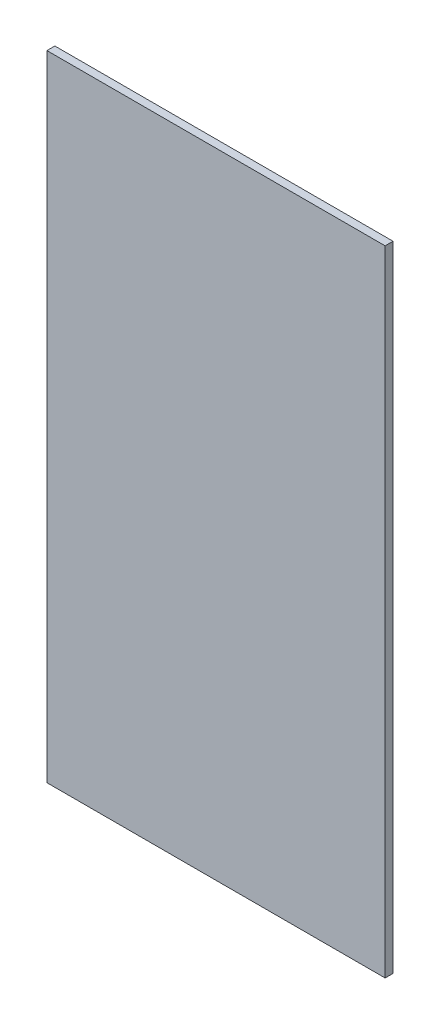
ISO-10303-21;
HEADER;
FILE_DESCRIPTION(('STEP AP214'),'2;1');
FILE_NAME('part.step','',(''),(''),'','','');
FILE_SCHEMA(('AUTOMOTIVE_DESIGN { 1 0 10303 214 1 1 1 1 }'));
ENDSEC;
DATA;
#1=APPLICATION_CONTEXT('core data for automotive mechanical design processes');
#2=APPLICATION_PROTOCOL_DEFINITION('international standard','automotive_design',2000,#1);
#3=PRODUCT_CONTEXT('',#1,'mechanical');
#4=PRODUCT('Part','Part','',(#3));
#5=PRODUCT_RELATED_PRODUCT_CATEGORY('part','',(#4));
#6=PRODUCT_DEFINITION_FORMATION('','',#4);
#7=PRODUCT_DEFINITION_CONTEXT('part definition',#1,'design');
#8=PRODUCT_DEFINITION('design','',#6,#7);
#9=PRODUCT_DEFINITION_SHAPE('','',#8);
#10=(LENGTH_UNIT() NAMED_UNIT(*) SI_UNIT(.MILLI.,.METRE.));
#11=(NAMED_UNIT(*) PLANE_ANGLE_UNIT() SI_UNIT($,.RADIAN.));
#12=(NAMED_UNIT(*) SI_UNIT($,.STERADIAN.) SOLID_ANGLE_UNIT());
#13=UNCERTAINTY_MEASURE_WITH_UNIT(LENGTH_MEASURE(1.E-05),#10,'distance_accuracy_value','');
#14=(GEOMETRIC_REPRESENTATION_CONTEXT(3) GLOBAL_UNCERTAINTY_ASSIGNED_CONTEXT((#13)) GLOBAL_UNIT_ASSIGNED_CONTEXT((#10,
#11,#12)) REPRESENTATION_CONTEXT('',''));
#15=CARTESIAN_POINT('',(0.,0.,0.));
#16=DIRECTION('',(0.,0.,1.));
#17=DIRECTION('',(1.,0.,0.));
#18=AXIS2_PLACEMENT_3D('',#15,#16,#17);
#19=CARTESIAN_POINT('',(1980.23201573366,1942.94051302504,19.05));
#20=DIRECTION('',(1.,0.,0.));
#21=DIRECTION('',(0.,0.,-1.));
#22=AXIS2_PLACEMENT_3D('',#19,#20,#21);
#23=PLANE('',#22);
#24=DIRECTION('',(0.,-1.,0.));
#25=VECTOR('',#24,1.);
#26=CARTESIAN_POINT('',(1980.23201573366,1942.94051302504,0.));
#27=LINE('',#26,#25);
#28=CARTESIAN_POINT('',(1980.23201573366,1942.94051302504,0.));
#29=VERTEX_POINT('',#28);
#30=CARTESIAN_POINT('',(1980.23201573366,418.94051302504,0.));
#31=VERTEX_POINT('',#30);
#32=EDGE_CURVE('E96',#29,#31,#27,.T.);
#33=ORIENTED_EDGE('',*,*,#32,.T.);
#34=DIRECTION('',(0.,0.,-1.));
#35=VECTOR('',#34,1.);
#36=CARTESIAN_POINT('',(1980.23201573366,418.94051302504,19.05));
#37=LINE('',#36,#35);
#38=CARTESIAN_POINT('',(1980.23201573366,418.94051302504,19.05));
#39=VERTEX_POINT('',#38);
#40=EDGE_CURVE('E11',#39,#31,#37,.T.);
#41=ORIENTED_EDGE('',*,*,#40,.F.);
#42=DIRECTION('',(0.,-1.,0.));
#43=VECTOR('',#42,1.);
#44=CARTESIAN_POINT('',(1980.23201573366,1942.94051302504,19.05));
#45=LINE('',#44,#43);
#46=CARTESIAN_POINT('',(1980.23201573366,1942.94051302504,19.05));
#47=VERTEX_POINT('',#46);
#48=EDGE_CURVE('E84',#47,#39,#45,.T.);
#49=ORIENTED_EDGE('',*,*,#48,.F.);
#50=DIRECTION('',(0.,0.,-1.));
#51=VECTOR('',#50,1.);
#52=CARTESIAN_POINT('',(1980.23201573366,1942.94051302504,19.05));
#53=LINE('',#52,#51);
#54=EDGE_CURVE('E92',#47,#29,#53,.T.);
#55=ORIENTED_EDGE('',*,*,#54,.T.);
#56=EDGE_LOOP('',(#33,#41,#49,#55));
#57=FACE_BOUND('',#56,.T.);
#58=ADVANCED_FACE('F33',(#57),#23,.F.);
#59=CARTESIAN_POINT('',(1980.23201573366,418.94051302504,19.05));
#60=DIRECTION('',(0.,1.,0.));
#61=DIRECTION('',(0.,0.,1.));
#62=AXIS2_PLACEMENT_3D('',#59,#60,#61);
#63=PLANE('',#62);
#64=DIRECTION('',(1.,0.,0.));
#65=VECTOR('',#64,1.);
#66=CARTESIAN_POINT('',(1980.23201573366,418.94051302504,0.));
#67=LINE('',#66,#65);
#68=CARTESIAN_POINT('',(2793.03201573366,418.94051302504,0.));
#69=VERTEX_POINT('',#68);
#70=EDGE_CURVE('E88',#31,#69,#67,.T.);
#71=ORIENTED_EDGE('',*,*,#70,.T.);
#72=DIRECTION('',(0.,0.,-1.));
#73=VECTOR('',#72,1.);
#74=CARTESIAN_POINT('',(2793.03201573366,418.94051302504,19.05));
#75=LINE('',#74,#73);
#76=CARTESIAN_POINT('',(2793.03201573366,418.94051302504,19.05));
#77=VERTEX_POINT('',#76);
#78=EDGE_CURVE('E41',#77,#69,#75,.T.);
#79=ORIENTED_EDGE('',*,*,#78,.F.);
#80=DIRECTION('',(1.,0.,0.));
#81=VECTOR('',#80,1.);
#82=CARTESIAN_POINT('',(1980.23201573366,418.94051302504,19.05));
#83=LINE('',#82,#81);
#84=EDGE_CURVE('E79',#39,#77,#83,.T.);
#85=ORIENTED_EDGE('',*,*,#84,.F.);
#86=ORIENTED_EDGE('',*,*,#40,.T.);
#87=EDGE_LOOP('',(#71,#79,#85,#86));
#88=FACE_BOUND('',#87,.T.);
#89=ADVANCED_FACE('F87',(#88),#63,.F.);
#90=CARTESIAN_POINT('',(2793.03201573366,418.94051302504,19.05));
#91=DIRECTION('',(-1.,0.,0.));
#92=DIRECTION('',(0.,0.,1.));
#93=AXIS2_PLACEMENT_3D('',#90,#91,#92);
#94=PLANE('',#93);
#95=DIRECTION('',(0.,1.,0.));
#96=VECTOR('',#95,1.);
#97=CARTESIAN_POINT('',(2793.03201573366,418.94051302504,0.));
#98=LINE('',#97,#96);
#99=CARTESIAN_POINT('',(2793.03201573366,1942.94051302504,0.));
#100=VERTEX_POINT('',#99);
#101=EDGE_CURVE('E66',#69,#100,#98,.T.);
#102=ORIENTED_EDGE('',*,*,#101,.T.);
#103=DIRECTION('',(0.,0.,-1.));
#104=VECTOR('',#103,1.);
#105=CARTESIAN_POINT('',(2793.03201573366,1942.94051302504,19.05));
#106=LINE('',#105,#104);
#107=CARTESIAN_POINT('',(2793.03201573366,1942.94051302504,19.05));
#108=VERTEX_POINT('',#107);
#109=EDGE_CURVE('E89',#108,#100,#106,.T.);
#110=ORIENTED_EDGE('',*,*,#109,.F.);
#111=DIRECTION('',(0.,1.,0.));
#112=VECTOR('',#111,1.);
#113=CARTESIAN_POINT('',(2793.03201573366,418.94051302504,19.05));
#114=LINE('',#113,#112);
#115=EDGE_CURVE('E82',#77,#108,#114,.T.);
#116=ORIENTED_EDGE('',*,*,#115,.F.);
#117=ORIENTED_EDGE('',*,*,#78,.T.);
#118=EDGE_LOOP('',(#102,#110,#116,#117));
#119=FACE_BOUND('',#118,.T.);
#120=ADVANCED_FACE('F90',(#119),#94,.F.);
#121=CARTESIAN_POINT('',(2793.03201573366,1942.94051302504,19.05));
#122=DIRECTION('',(0.,-1.,0.));
#123=DIRECTION('',(0.,0.,-1.));
#124=AXIS2_PLACEMENT_3D('',#121,#122,#123);
#125=PLANE('',#124);
#126=DIRECTION('',(-1.,0.,0.));
#127=VECTOR('',#126,1.);
#128=CARTESIAN_POINT('',(2793.03201573366,1942.94051302504,0.));
#129=LINE('',#128,#127);
#130=EDGE_CURVE('E72',#100,#29,#129,.T.);
#131=ORIENTED_EDGE('',*,*,#130,.T.);
#132=ORIENTED_EDGE('',*,*,#54,.F.);
#133=DIRECTION('',(-1.,0.,0.));
#134=VECTOR('',#133,1.);
#135=CARTESIAN_POINT('',(2793.03201573366,1942.94051302504,19.05));
#136=LINE('',#135,#134);
#137=EDGE_CURVE('E49',#108,#47,#136,.T.);
#138=ORIENTED_EDGE('',*,*,#137,.F.);
#139=ORIENTED_EDGE('',*,*,#109,.T.);
#140=EDGE_LOOP('',(#131,#132,#138,#139));
#141=FACE_BOUND('',#140,.T.);
#142=ADVANCED_FACE('F103',(#141),#125,.F.);
#143=CARTESIAN_POINT('',(0.,0.,19.05));
#144=DIRECTION('',(0.,0.,1.));
#145=DIRECTION('',(1.,0.,0.));
#146=AXIS2_PLACEMENT_3D('',#143,#144,#145);
#147=PLANE('',#146);
#148=ORIENTED_EDGE('',*,*,#48,.T.);
#149=ORIENTED_EDGE('',*,*,#84,.T.);
#150=ORIENTED_EDGE('',*,*,#115,.T.);
#151=ORIENTED_EDGE('',*,*,#137,.T.);
#152=EDGE_LOOP('',(#148,#149,#150,#151));
#153=FACE_BOUND('',#152,.T.);
#154=ADVANCED_FACE('F80',(#153),#147,.T.);
#155=CARTESIAN_POINT('',(0.,0.,0.));
#156=DIRECTION('',(0.,0.,1.));
#157=DIRECTION('',(1.,0.,0.));
#158=AXIS2_PLACEMENT_3D('',#155,#156,#157);
#159=PLANE('',#158);
#160=ORIENTED_EDGE('',*,*,#32,.F.);
#161=ORIENTED_EDGE('',*,*,#130,.F.);
#162=ORIENTED_EDGE('',*,*,#101,.F.);
#163=ORIENTED_EDGE('',*,*,#70,.F.);
#164=EDGE_LOOP('',(#160,#161,#162,#163));
#165=FACE_BOUND('',#164,.T.);
#166=ADVANCED_FACE('F106',(#165),#159,.F.);
#167=CLOSED_SHELL('',(#58,#89,#120,#142,#154,#166));
#168=MANIFOLD_SOLID_BREP('B2',#167);
#169=ADVANCED_BREP_SHAPE_REPRESENTATION('',(#18,#168),#14);
#170=SHAPE_DEFINITION_REPRESENTATION(#9,#169);
ENDSEC;
END-ISO-10303-21;
